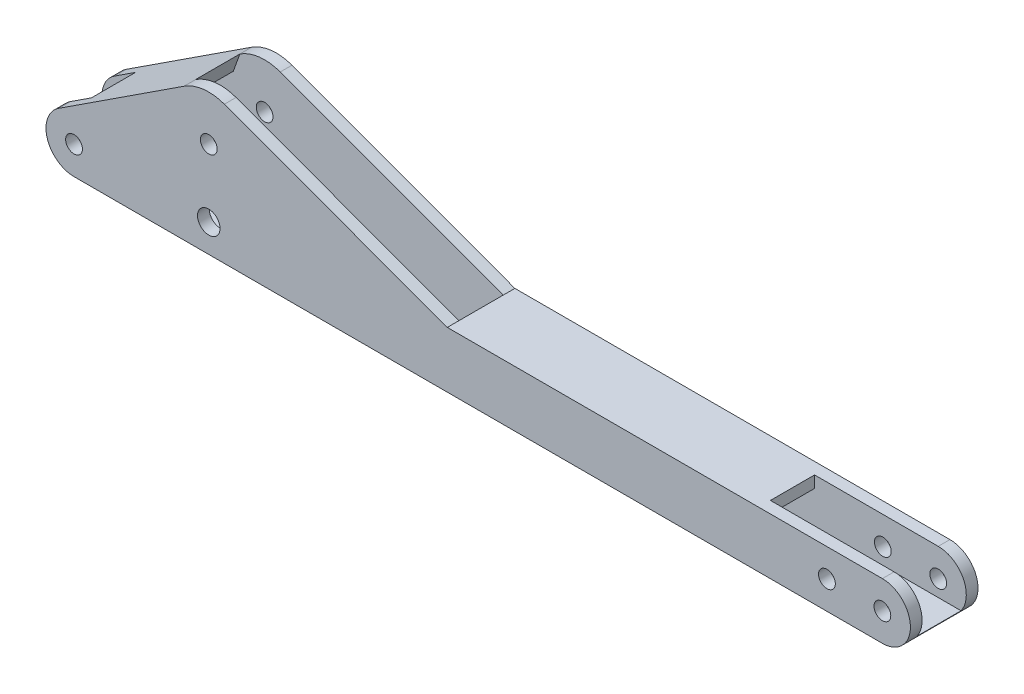
ISO-10303-21;
HEADER;
FILE_DESCRIPTION(('STEP AP214'),'2;1');
FILE_NAME('part.step','',(''),(''),'','','');
FILE_SCHEMA(('AUTOMOTIVE_DESIGN { 1 0 10303 214 1 1 1 1 }'));
ENDSEC;
DATA;
#1=APPLICATION_CONTEXT('core data for automotive mechanical design processes');
#2=APPLICATION_PROTOCOL_DEFINITION('international standard','automotive_design',2000,#1);
#3=PRODUCT_CONTEXT('',#1,'mechanical');
#4=PRODUCT('Part','Part','',(#3));
#5=PRODUCT_RELATED_PRODUCT_CATEGORY('part','',(#4));
#6=PRODUCT_DEFINITION_FORMATION('','',#4);
#7=PRODUCT_DEFINITION_CONTEXT('part definition',#1,'design');
#8=PRODUCT_DEFINITION('design','',#6,#7);
#9=PRODUCT_DEFINITION_SHAPE('','',#8);
#10=(LENGTH_UNIT() NAMED_UNIT(*) SI_UNIT(.MILLI.,.METRE.));
#11=(NAMED_UNIT(*) PLANE_ANGLE_UNIT() SI_UNIT($,.RADIAN.));
#12=(NAMED_UNIT(*) SI_UNIT($,.STERADIAN.) SOLID_ANGLE_UNIT());
#13=UNCERTAINTY_MEASURE_WITH_UNIT(LENGTH_MEASURE(1.E-05),#10,'distance_accuracy_value','');
#14=(GEOMETRIC_REPRESENTATION_CONTEXT(3) GLOBAL_UNCERTAINTY_ASSIGNED_CONTEXT((#13)) GLOBAL_UNIT_ASSIGNED_CONTEXT((#10,
#11,#12)) REPRESENTATION_CONTEXT('',''));
#15=CARTESIAN_POINT('',(0.,0.,0.));
#16=DIRECTION('',(0.,0.,1.));
#17=DIRECTION('',(1.,0.,0.));
#18=AXIS2_PLACEMENT_3D('',#15,#16,#17);
#19=CARTESIAN_POINT('',(0.,0.,153.));
#20=DIRECTION('',(0.,0.,-1.));
#21=DIRECTION('',(-1.,0.,0.));
#22=AXIS2_PLACEMENT_3D('',#19,#20,#21);
#23=CYLINDRICAL_SURFACE('',#22,127.);
#24=CARTESIAN_POINT('',(0.,0.,100.));
#25=DIRECTION('',(0.,0.,-1.));
#26=DIRECTION('',(-1.,0.,0.));
#27=AXIS2_PLACEMENT_3D('',#24,#25,#26);
#28=CIRCLE('',#27,127.);
#29=CARTESIAN_POINT('',(0.,-127.,100.));
#30=VERTEX_POINT('',#29);
#31=CARTESIAN_POINT('',(-69.4149225897887,106.351156654987,100.));
#32=VERTEX_POINT('',#31);
#33=EDGE_CURVE('E315',#30,#32,#28,.T.);
#34=ORIENTED_EDGE('',*,*,#33,.F.);
#35=DIRECTION('',(0.,0.,-1.));
#36=VECTOR('',#35,1.);
#37=CARTESIAN_POINT('',(0.,-127.,153.));
#38=LINE('',#37,#36);
#39=CARTESIAN_POINT('',(0.,-127.,153.));
#40=VERTEX_POINT('',#39);
#41=EDGE_CURVE('E495',#40,#30,#38,.T.);
#42=ORIENTED_EDGE('',*,*,#41,.F.);
#43=CARTESIAN_POINT('',(0.,0.,153.));
#44=DIRECTION('',(0.,0.,1.));
#45=DIRECTION('',(1.,0.,0.));
#46=AXIS2_PLACEMENT_3D('',#43,#44,#45);
#47=CIRCLE('',#46,127.);
#48=CARTESIAN_POINT('',(-69.4149225897887,106.351156654987,153.));
#49=VERTEX_POINT('',#48);
#50=EDGE_CURVE('E417',#49,#40,#47,.T.);
#51=ORIENTED_EDGE('',*,*,#50,.F.);
#52=DIRECTION('',(0.,0.,-1.));
#53=VECTOR('',#52,1.);
#54=CARTESIAN_POINT('',(-69.4149225897887,106.351156654987,153.));
#55=LINE('',#54,#53);
#56=EDGE_CURVE('E466',#49,#32,#55,.T.);
#57=ORIENTED_EDGE('',*,*,#56,.T.);
#58=EDGE_LOOP('',(#34,#42,#51,#57));
#59=FACE_BOUND('',#58,.T.);
#60=ADVANCED_FACE('F45',(#59),#23,.T.);
#61=CARTESIAN_POINT('',(1690.,127.,153.));
#62=DIRECTION('',(-0.344538386114745,-0.938772230359125,0.));
#63=DIRECTION('',(0.938772230359126,-0.344538386114745,0.));
#64=AXIS2_PLACEMENT_3D('',#61,#62,#63);
#65=PLANE('',#64);
#66=DIRECTION('',(0.938772230359126,-0.344538386114745,0.));
#67=VECTOR('',#66,1.);
#68=CARTESIAN_POINT('',(1690.,127.,100.));
#69=LINE('',#68,#67);
#70=CARTESIAN_POINT('',(680.630369153523,497.448307223621,100.));
#71=VERTEX_POINT('',#70);
#72=CARTESIAN_POINT('',(1690.,127.,100.));
#73=VERTEX_POINT('',#72);
#74=EDGE_CURVE('E324',#71,#73,#69,.T.);
#75=ORIENTED_EDGE('',*,*,#74,.F.);
#76=DIRECTION('',(0.,0.,-1.));
#77=VECTOR('',#76,1.);
#78=CARTESIAN_POINT('',(680.630369153523,497.448307223621,153.));
#79=LINE('',#78,#77);
#80=CARTESIAN_POINT('',(680.630369153523,497.448307223621,153.));
#81=VERTEX_POINT('',#80);
#82=EDGE_CURVE('E476',#81,#71,#79,.T.);
#83=ORIENTED_EDGE('',*,*,#82,.F.);
#84=DIRECTION('',(-0.938772230359125,0.344538386114745,0.));
#85=VECTOR('',#84,1.);
#86=CARTESIAN_POINT('',(1690.,127.,153.));
#87=LINE('',#86,#85);
#88=CARTESIAN_POINT('',(1690.,127.,153.));
#89=VERTEX_POINT('',#88);
#90=EDGE_CURVE('E431',#89,#81,#87,.T.);
#91=ORIENTED_EDGE('',*,*,#90,.F.);
#92=DIRECTION('',(0.,0.,-1.));
#93=VECTOR('',#92,1.);
#94=CARTESIAN_POINT('',(1690.,127.,153.));
#95=LINE('',#94,#93);
#96=EDGE_CURVE('E481',#89,#73,#95,.T.);
#97=ORIENTED_EDGE('',*,*,#96,.T.);
#98=EDGE_LOOP('',(#75,#83,#91,#97));
#99=FACE_BOUND('',#98,.T.);
#100=ADVANCED_FACE('F584',(#99),#65,.F.);
#101=CARTESIAN_POINT('',(610.,305.,153.));
#102=DIRECTION('',(0.,0.,-1.));
#103=DIRECTION('',(-1.,0.,0.));
#104=AXIS2_PLACEMENT_3D('',#101,#102,#103);
#105=CYLINDRICAL_SURFACE('',#104,205.);
#106=CARTESIAN_POINT('',(610.,305.,100.));
#107=DIRECTION('',(0.,0.,-1.));
#108=DIRECTION('',(-1.,0.,0.));
#109=AXIS2_PLACEMENT_3D('',#106,#107,#108);
#110=CIRCLE('',#109,205.);
#111=CARTESIAN_POINT('',(497.952290307821,476.66918987616,100.));
#112=VERTEX_POINT('',#111);
#113=EDGE_CURVE('E321',#112,#71,#110,.T.);
#114=ORIENTED_EDGE('',*,*,#113,.F.);
#115=DIRECTION('',(0.,0.,-1.));
#116=VECTOR('',#115,1.);
#117=CARTESIAN_POINT('',(497.952290307821,476.66918987616,153.));
#118=LINE('',#117,#116);
#119=CARTESIAN_POINT('',(497.952290307821,476.66918987616,153.));
#120=VERTEX_POINT('',#119);
#121=EDGE_CURVE('E471',#120,#112,#118,.T.);
#122=ORIENTED_EDGE('',*,*,#121,.F.);
#123=CARTESIAN_POINT('',(610.,305.,153.));
#124=DIRECTION('',(0.,0.,1.));
#125=DIRECTION('',(1.,0.,0.));
#126=AXIS2_PLACEMENT_3D('',#123,#124,#125);
#127=CIRCLE('',#126,205.);
#128=EDGE_CURVE('E434',#81,#120,#127,.T.);
#129=ORIENTED_EDGE('',*,*,#128,.F.);
#130=ORIENTED_EDGE('',*,*,#82,.T.);
#131=EDGE_LOOP('',(#114,#122,#129,#130));
#132=FACE_BOUND('',#131,.T.);
#133=ADVANCED_FACE('F588',(#132),#105,.T.);
#134=CARTESIAN_POINT('',(0.,0.,153.));
#135=DIRECTION('',(0.,0.,-1.));
#136=DIRECTION('',(-1.,0.,0.));
#137=AXIS2_PLACEMENT_3D('',#134,#135,#136);
#138=CYLINDRICAL_SURFACE('',#137,38.);
#139=CARTESIAN_POINT('',(0.,0.,153.));
#140=DIRECTION('',(0.,0.,1.));
#141=DIRECTION('',(1.,0.,0.));
#142=AXIS2_PLACEMENT_3D('',#139,#140,#141);
#143=CIRCLE('',#142,38.);
#144=CARTESIAN_POINT('',(38.,0.,153.));
#145=VERTEX_POINT('',#144);
#146=EDGE_CURVE('E409',#145,#145,#143,.T.);
#147=ORIENTED_EDGE('',*,*,#146,.T.);
#148=EDGE_LOOP('',(#147));
#149=FACE_BOUND('',#148,.T.);
#150=CARTESIAN_POINT('',(0.,0.,100.));
#151=DIRECTION('',(0.,0.,-1.));
#152=DIRECTION('',(-1.,0.,0.));
#153=AXIS2_PLACEMENT_3D('',#150,#151,#152);
#154=CIRCLE('',#153,38.);
#155=CARTESIAN_POINT('',(-38.,0.,100.));
#156=VERTEX_POINT('',#155);
#157=EDGE_CURVE('E308',#156,#156,#154,.T.);
#158=ORIENTED_EDGE('',*,*,#157,.T.);
#159=EDGE_LOOP('',(#158));
#160=FACE_BOUND('',#159,.T.);
#161=ADVANCED_FACE('F645',(#149,#160),#138,.F.);
#162=CARTESIAN_POINT('',(610.,0.,153.));
#163=DIRECTION('',(0.,0.,-1.));
#164=DIRECTION('',(-1.,0.,0.));
#165=AXIS2_PLACEMENT_3D('',#162,#163,#164);
#166=CYLINDRICAL_SURFACE('',#165,51.0000000000001);
#167=CARTESIAN_POINT('',(610.,0.,153.));
#168=DIRECTION('',(0.,0.,1.));
#169=DIRECTION('',(1.,0.,0.));
#170=AXIS2_PLACEMENT_3D('',#167,#168,#169);
#171=CIRCLE('',#170,51.0000000000001);
#172=CARTESIAN_POINT('',(661.,0.,153.));
#173=VERTEX_POINT('',#172);
#174=EDGE_CURVE('E401',#173,#173,#171,.T.);
#175=ORIENTED_EDGE('',*,*,#174,.T.);
#176=EDGE_LOOP('',(#175));
#177=FACE_BOUND('',#176,.T.);
#178=CARTESIAN_POINT('',(610.,0.,100.));
#179=DIRECTION('',(0.,0.,-1.));
#180=DIRECTION('',(-1.,0.,0.));
#181=AXIS2_PLACEMENT_3D('',#178,#179,#180);
#182=CIRCLE('',#181,51.0000000000001);
#183=CARTESIAN_POINT('',(559.,0.,100.));
#184=VERTEX_POINT('',#183);
#185=EDGE_CURVE('E304',#184,#184,#182,.T.);
#186=ORIENTED_EDGE('',*,*,#185,.T.);
#187=EDGE_LOOP('',(#186));
#188=FACE_BOUND('',#187,.T.);
#189=ADVANCED_FACE('F654',(#177,#188),#166,.F.);
#190=CARTESIAN_POINT('',(610.,305.,153.));
#191=DIRECTION('',(0.,0.,-1.));
#192=DIRECTION('',(-1.,0.,0.));
#193=AXIS2_PLACEMENT_3D('',#190,#191,#192);
#194=CYLINDRICAL_SURFACE('',#193,38.);
#195=CARTESIAN_POINT('',(610.,305.,153.));
#196=DIRECTION('',(0.,0.,1.));
#197=DIRECTION('',(1.,0.,0.));
#198=AXIS2_PLACEMENT_3D('',#195,#196,#197);
#199=CIRCLE('',#198,38.);
#200=CARTESIAN_POINT('',(648.,305.,153.));
#201=VERTEX_POINT('',#200);
#202=EDGE_CURVE('E393',#201,#201,#199,.T.);
#203=ORIENTED_EDGE('',*,*,#202,.T.);
#204=EDGE_LOOP('',(#203));
#205=FACE_BOUND('',#204,.T.);
#206=CARTESIAN_POINT('',(610.,305.,100.));
#207=DIRECTION('',(0.,0.,-1.));
#208=DIRECTION('',(-1.,0.,0.));
#209=AXIS2_PLACEMENT_3D('',#206,#207,#208);
#210=CIRCLE('',#209,38.);
#211=CARTESIAN_POINT('',(572.,305.,100.));
#212=VERTEX_POINT('',#211);
#213=EDGE_CURVE('E300',#212,#212,#210,.T.);
#214=ORIENTED_EDGE('',*,*,#213,.T.);
#215=EDGE_LOOP('',(#214));
#216=FACE_BOUND('',#215,.T.);
#217=ADVANCED_FACE('F662',(#205,#216),#194,.F.);
#218=CARTESIAN_POINT('',(3409.,0.,153.));
#219=DIRECTION('',(0.,0.,-1.));
#220=DIRECTION('',(-1.,0.,0.));
#221=AXIS2_PLACEMENT_3D('',#218,#219,#220);
#222=CYLINDRICAL_SURFACE('',#221,38.0000000000003);
#223=CARTESIAN_POINT('',(3409.,0.,153.));
#224=DIRECTION('',(0.,0.,1.));
#225=DIRECTION('',(1.,0.,0.));
#226=AXIS2_PLACEMENT_3D('',#223,#224,#225);
#227=CIRCLE('',#226,38.0000000000003);
#228=CARTESIAN_POINT('',(3447.,0.,153.));
#229=VERTEX_POINT('',#228);
#230=EDGE_CURVE('E385',#229,#229,#227,.T.);
#231=ORIENTED_EDGE('',*,*,#230,.T.);
#232=EDGE_LOOP('',(#231));
#233=FACE_BOUND('',#232,.T.);
#234=CARTESIAN_POINT('',(3409.,0.,100.));
#235=DIRECTION('',(0.,0.,-1.));
#236=DIRECTION('',(-1.,0.,0.));
#237=AXIS2_PLACEMENT_3D('',#234,#235,#236);
#238=CIRCLE('',#237,38.0000000000003);
#239=CARTESIAN_POINT('',(3371.,0.,100.));
#240=VERTEX_POINT('',#239);
#241=EDGE_CURVE('E296',#240,#240,#238,.T.);
#242=ORIENTED_EDGE('',*,*,#241,.T.);
#243=EDGE_LOOP('',(#242));
#244=FACE_BOUND('',#243,.T.);
#245=ADVANCED_FACE('F669',(#233,#244),#222,.F.);
#246=CARTESIAN_POINT('',(3660.,0.,153.));
#247=DIRECTION('',(0.,0.,-1.));
#248=DIRECTION('',(-1.,0.,0.));
#249=AXIS2_PLACEMENT_3D('',#246,#247,#248);
#250=CYLINDRICAL_SURFACE('',#249,37.9999999999998);
#251=CARTESIAN_POINT('',(3660.,0.,153.));
#252=DIRECTION('',(0.,0.,1.));
#253=DIRECTION('',(1.,0.,0.));
#254=AXIS2_PLACEMENT_3D('',#251,#252,#253);
#255=CIRCLE('',#254,37.9999999999998);
#256=CARTESIAN_POINT('',(3698.,0.,153.));
#257=VERTEX_POINT('',#256);
#258=EDGE_CURVE('E377',#257,#257,#255,.T.);
#259=ORIENTED_EDGE('',*,*,#258,.T.);
#260=EDGE_LOOP('',(#259));
#261=FACE_BOUND('',#260,.T.);
#262=CARTESIAN_POINT('',(3660.,0.,100.));
#263=DIRECTION('',(0.,0.,-1.));
#264=DIRECTION('',(-1.,0.,0.));
#265=AXIS2_PLACEMENT_3D('',#262,#263,#264);
#266=CIRCLE('',#265,37.9999999999998);
#267=CARTESIAN_POINT('',(3622.,0.,100.));
#268=VERTEX_POINT('',#267);
#269=EDGE_CURVE('E273',#268,#268,#266,.T.);
#270=ORIENTED_EDGE('',*,*,#269,.T.);
#271=EDGE_LOOP('',(#270));
#272=FACE_BOUND('',#271,.T.);
#273=ADVANCED_FACE('F581',(#261,#272),#250,.F.);
#274=CARTESIAN_POINT('',(0.,0.,153.));
#275=DIRECTION('',(0.,0.,1.));
#276=DIRECTION('',(1.,0.,0.));
#277=AXIS2_PLACEMENT_3D('',#274,#275,#276);
#278=PLANE('',#277);
#279=ORIENTED_EDGE('',*,*,#230,.F.);
#280=EDGE_LOOP('',(#279));
#281=FACE_BOUND('',#280,.T.);
#282=ORIENTED_EDGE('',*,*,#174,.F.);
#283=EDGE_LOOP('',(#282));
#284=FACE_BOUND('',#283,.T.);
#285=ORIENTED_EDGE('',*,*,#50,.T.);
#286=DIRECTION('',(1.,0.,0.));
#287=VECTOR('',#286,1.);
#288=CARTESIAN_POINT('',(0.,-127.,153.));
#289=LINE('',#288,#287);
#290=CARTESIAN_POINT('',(3660.,-127.,153.));
#291=VERTEX_POINT('',#290);
#292=EDGE_CURVE('E421',#40,#291,#289,.T.);
#293=ORIENTED_EDGE('',*,*,#292,.T.);
#294=CARTESIAN_POINT('',(3660.,0.,153.));
#295=DIRECTION('',(0.,0.,1.));
#296=DIRECTION('',(1.,0.,0.));
#297=AXIS2_PLACEMENT_3D('',#294,#295,#296);
#298=CIRCLE('',#297,127.);
#299=CARTESIAN_POINT('',(3660.,127.,153.));
#300=VERTEX_POINT('',#299);
#301=EDGE_CURVE('E425',#291,#300,#298,.T.);
#302=ORIENTED_EDGE('',*,*,#301,.T.);
#303=DIRECTION('',(-1.,0.,0.));
#304=VECTOR('',#303,1.);
#305=CARTESIAN_POINT('',(3660.,127.,153.));
#306=LINE('',#305,#304);
#307=EDGE_CURVE('E428',#300,#89,#306,.T.);
#308=ORIENTED_EDGE('',*,*,#307,.T.);
#309=ORIENTED_EDGE('',*,*,#90,.T.);
#310=ORIENTED_EDGE('',*,*,#128,.T.);
#311=DIRECTION('',(-0.837410682322734,-0.546574193620383,0.));
#312=VECTOR('',#311,1.);
#313=CARTESIAN_POINT('',(-69.4149225897887,106.351156654987,153.));
#314=LINE('',#313,#312);
#315=EDGE_CURVE('E437',#120,#49,#314,.T.);
#316=ORIENTED_EDGE('',*,*,#315,.T.);
#317=EDGE_LOOP('',(#285,#293,#302,#308,#309,#310,#316));
#318=FACE_BOUND('',#317,.T.);
#319=ORIENTED_EDGE('',*,*,#146,.F.);
#320=EDGE_LOOP('',(#319));
#321=FACE_BOUND('',#320,.T.);
#322=ORIENTED_EDGE('',*,*,#202,.F.);
#323=EDGE_LOOP('',(#322));
#324=FACE_BOUND('',#323,.T.);
#325=ORIENTED_EDGE('',*,*,#258,.F.);
#326=EDGE_LOOP('',(#325));
#327=FACE_BOUND('',#326,.T.);
#328=ADVANCED_FACE('F548',(#281,#284,#318,#321,#324,#327),#278,.T.);
#329=CARTESIAN_POINT('',(0.,0.,-153.));
#330=DIRECTION('',(0.,0.,1.));
#331=DIRECTION('',(1.,0.,0.));
#332=AXIS2_PLACEMENT_3D('',#329,#330,#331);
#333=PLANE('',#332);
#334=CARTESIAN_POINT('',(0.,0.,-153.));
#335=DIRECTION('',(0.,0.,1.));
#336=DIRECTION('',(1.,0.,0.));
#337=AXIS2_PLACEMENT_3D('',#334,#335,#336);
#338=CIRCLE('',#337,127.);
#339=CARTESIAN_POINT('',(-69.4149225897887,106.351156654987,-153.));
#340=VERTEX_POINT('',#339);
#341=CARTESIAN_POINT('',(0.,-127.,-153.));
#342=VERTEX_POINT('',#341);
#343=EDGE_CURVE('E413',#340,#342,#338,.T.);
#344=ORIENTED_EDGE('',*,*,#343,.F.);
#345=DIRECTION('',(-0.837410682322734,-0.546574193620383,0.));
#346=VECTOR('',#345,1.);
#347=CARTESIAN_POINT('',(-69.4149225897887,106.351156654987,-153.));
#348=LINE('',#347,#346);
#349=CARTESIAN_POINT('',(497.952290307821,476.66918987616,-153.));
#350=VERTEX_POINT('',#349);
#351=EDGE_CURVE('E422',#350,#340,#348,.T.);
#352=ORIENTED_EDGE('',*,*,#351,.F.);
#353=CARTESIAN_POINT('',(610.,305.,-153.));
#354=DIRECTION('',(0.,0.,1.));
#355=DIRECTION('',(1.,0.,0.));
#356=AXIS2_PLACEMENT_3D('',#353,#354,#355);
#357=CIRCLE('',#356,205.);
#358=CARTESIAN_POINT('',(680.630369153523,497.448307223621,-153.));
#359=VERTEX_POINT('',#358);
#360=EDGE_CURVE('E459',#359,#350,#357,.T.);
#361=ORIENTED_EDGE('',*,*,#360,.F.);
#362=DIRECTION('',(-0.938772230359125,0.344538386114745,0.));
#363=VECTOR('',#362,1.);
#364=CARTESIAN_POINT('',(1690.,127.,-153.));
#365=LINE('',#364,#363);
#366=CARTESIAN_POINT('',(1690.,127.,-153.));
#367=VERTEX_POINT('',#366);
#368=EDGE_CURVE('E455',#367,#359,#365,.T.);
#369=ORIENTED_EDGE('',*,*,#368,.F.);
#370=DIRECTION('',(-1.,0.,0.));
#371=VECTOR('',#370,1.);
#372=CARTESIAN_POINT('',(3660.,127.,-153.));
#373=LINE('',#372,#371);
#374=CARTESIAN_POINT('',(3660.,127.,-153.));
#375=VERTEX_POINT('',#374);
#376=EDGE_CURVE('E451',#375,#367,#373,.T.);
#377=ORIENTED_EDGE('',*,*,#376,.F.);
#378=CARTESIAN_POINT('',(3660.,0.,-153.));
#379=DIRECTION('',(0.,0.,1.));
#380=DIRECTION('',(1.,0.,0.));
#381=AXIS2_PLACEMENT_3D('',#378,#379,#380);
#382=CIRCLE('',#381,127.);
#383=CARTESIAN_POINT('',(3660.,-127.,-153.));
#384=VERTEX_POINT('',#383);
#385=EDGE_CURVE('E447',#384,#375,#382,.T.);
#386=ORIENTED_EDGE('',*,*,#385,.F.);
#387=DIRECTION('',(1.,0.,0.));
#388=VECTOR('',#387,1.);
#389=CARTESIAN_POINT('',(0.,-127.,-153.));
#390=LINE('',#389,#388);
#391=EDGE_CURVE('E444',#342,#384,#390,.T.);
#392=ORIENTED_EDGE('',*,*,#391,.F.);
#393=EDGE_LOOP('',(#344,#352,#361,#369,#377,#386,#392));
#394=FACE_BOUND('',#393,.T.);
#395=CARTESIAN_POINT('',(0.,0.,-153.));
#396=DIRECTION('',(0.,0.,1.));
#397=DIRECTION('',(1.,0.,0.));
#398=AXIS2_PLACEMENT_3D('',#395,#396,#397);
#399=CIRCLE('',#398,38.);
#400=CARTESIAN_POINT('',(38.,0.,-153.));
#401=VERTEX_POINT('',#400);
#402=EDGE_CURVE('E405',#401,#401,#399,.T.);
#403=ORIENTED_EDGE('',*,*,#402,.T.);
#404=EDGE_LOOP('',(#403));
#405=FACE_BOUND('',#404,.T.);
#406=CARTESIAN_POINT('',(610.,0.,-153.));
#407=DIRECTION('',(0.,0.,1.));
#408=DIRECTION('',(1.,0.,0.));
#409=AXIS2_PLACEMENT_3D('',#406,#407,#408);
#410=CIRCLE('',#409,51.0000000000001);
#411=CARTESIAN_POINT('',(661.,0.,-153.));
#412=VERTEX_POINT('',#411);
#413=EDGE_CURVE('E397',#412,#412,#410,.T.);
#414=ORIENTED_EDGE('',*,*,#413,.T.);
#415=EDGE_LOOP('',(#414));
#416=FACE_BOUND('',#415,.T.);
#417=CARTESIAN_POINT('',(610.,305.,-153.));
#418=DIRECTION('',(0.,0.,1.));
#419=DIRECTION('',(1.,0.,0.));
#420=AXIS2_PLACEMENT_3D('',#417,#418,#419);
#421=CIRCLE('',#420,38.);
#422=CARTESIAN_POINT('',(648.,305.,-153.));
#423=VERTEX_POINT('',#422);
#424=EDGE_CURVE('E389',#423,#423,#421,.T.);
#425=ORIENTED_EDGE('',*,*,#424,.T.);
#426=EDGE_LOOP('',(#425));
#427=FACE_BOUND('',#426,.T.);
#428=CARTESIAN_POINT('',(3409.,0.,-153.));
#429=DIRECTION('',(0.,0.,1.));
#430=DIRECTION('',(1.,0.,0.));
#431=AXIS2_PLACEMENT_3D('',#428,#429,#430);
#432=CIRCLE('',#431,38.0000000000003);
#433=CARTESIAN_POINT('',(3447.,0.,-153.));
#434=VERTEX_POINT('',#433);
#435=EDGE_CURVE('E381',#434,#434,#432,.T.);
#436=ORIENTED_EDGE('',*,*,#435,.T.);
#437=EDGE_LOOP('',(#436));
#438=FACE_BOUND('',#437,.T.);
#439=CARTESIAN_POINT('',(3660.,0.,-153.));
#440=DIRECTION('',(0.,0.,1.));
#441=DIRECTION('',(1.,0.,0.));
#442=AXIS2_PLACEMENT_3D('',#439,#440,#441);
#443=CIRCLE('',#442,37.9999999999998);
#444=CARTESIAN_POINT('',(3698.,0.,-153.));
#445=VERTEX_POINT('',#444);
#446=EDGE_CURVE('E376',#445,#445,#443,.T.);
#447=ORIENTED_EDGE('',*,*,#446,.T.);
#448=EDGE_LOOP('',(#447));
#449=FACE_BOUND('',#448,.T.);
#450=ADVANCED_FACE('F538',(#394,#405,#416,#427,#438,#449),#333,.F.);
#451=CARTESIAN_POINT('',(0.,-127.,-100.));
#452=VERTEX_POINT('',#451);
#453=EDGE_CURVE('E494',#452,#342,#38,.T.);
#454=ORIENTED_EDGE('',*,*,#453,.F.);
#455=CARTESIAN_POINT('',(0.,0.,-100.));
#456=DIRECTION('',(0.,0.,-1.));
#457=DIRECTION('',(-1.,0.,0.));
#458=AXIS2_PLACEMENT_3D('',#455,#456,#457);
#459=CIRCLE('',#458,127.);
#460=CARTESIAN_POINT('',(-69.4149225897887,106.351156654987,-100.));
#461=VERTEX_POINT('',#460);
#462=EDGE_CURVE('E354',#452,#461,#459,.T.);
#463=ORIENTED_EDGE('',*,*,#462,.T.);
#464=EDGE_CURVE('E440',#461,#340,#55,.T.);
#465=ORIENTED_EDGE('',*,*,#464,.T.);
#466=ORIENTED_EDGE('',*,*,#343,.T.);
#467=EDGE_LOOP('',(#454,#463,#465,#466));
#468=FACE_BOUND('',#467,.T.);
#469=ADVANCED_FACE('F47',(#468),#23,.T.);
#470=CARTESIAN_POINT('',(0.,-127.,153.));
#471=DIRECTION('',(0.,1.,0.));
#472=DIRECTION('',(-1.,0.,0.));
#473=AXIS2_PLACEMENT_3D('',#470,#471,#472);
#474=PLANE('',#473);
#475=DIRECTION('',(0.,0.,1.));
#476=VECTOR('',#475,1.);
#477=CARTESIAN_POINT('',(218.242094516465,-127.,-100.));
#478=LINE('',#477,#476);
#479=CARTESIAN_POINT('',(218.242094516465,-127.,-100.));
#480=VERTEX_POINT('',#479);
#481=CARTESIAN_POINT('',(218.242094516465,-127.,100.));
#482=VERTEX_POINT('',#481);
#483=EDGE_CURVE('E285',#480,#482,#478,.T.);
#484=ORIENTED_EDGE('',*,*,#483,.F.);
#485=DIRECTION('',(-1.,0.,0.));
#486=VECTOR('',#485,1.);
#487=CARTESIAN_POINT('',(0.,-127.,-100.));
#488=LINE('',#487,#486);
#489=EDGE_CURVE('E358',#480,#452,#488,.T.);
#490=ORIENTED_EDGE('',*,*,#489,.T.);
#491=ORIENTED_EDGE('',*,*,#453,.T.);
#492=ORIENTED_EDGE('',*,*,#391,.T.);
#493=DIRECTION('',(0.,0.,-1.));
#494=VECTOR('',#493,1.);
#495=CARTESIAN_POINT('',(3660.,-127.,153.));
#496=LINE('',#495,#494);
#497=EDGE_CURVE('E490',#291,#384,#496,.T.);
#498=ORIENTED_EDGE('',*,*,#497,.F.);
#499=ORIENTED_EDGE('',*,*,#292,.F.);
#500=ORIENTED_EDGE('',*,*,#41,.T.);
#501=DIRECTION('',(-1.,0.,0.));
#502=VECTOR('',#501,1.);
#503=CARTESIAN_POINT('',(0.,-127.,100.));
#504=LINE('',#503,#502);
#505=EDGE_CURVE('E318',#482,#30,#504,.T.);
#506=ORIENTED_EDGE('',*,*,#505,.F.);
#507=EDGE_LOOP('',(#484,#490,#491,#492,#498,#499,#500,#506));
#508=FACE_BOUND('',#507,.T.);
#509=ADVANCED_FACE('F543',(#508),#474,.F.);
#510=CARTESIAN_POINT('',(3660.,0.,153.));
#511=DIRECTION('',(0.,0.,-1.));
#512=DIRECTION('',(-1.,0.,0.));
#513=AXIS2_PLACEMENT_3D('',#510,#511,#512);
#514=CYLINDRICAL_SURFACE('',#513,127.);
#515=DIRECTION('',(0.,0.,-1.));
#516=VECTOR('',#515,1.);
#517=CARTESIAN_POINT('',(3660.,127.,153.));
#518=LINE('',#517,#516);
#519=CARTESIAN_POINT('',(3660.,127.,-100.));
#520=VERTEX_POINT('',#519);
#521=EDGE_CURVE('E485',#520,#375,#518,.T.);
#522=ORIENTED_EDGE('',*,*,#521,.F.);
#523=CARTESIAN_POINT('',(3660.,0.,-100.));
#524=DIRECTION('',(0.,0.,-1.));
#525=DIRECTION('',(-1.,0.,0.));
#526=AXIS2_PLACEMENT_3D('',#523,#524,#525);
#527=CIRCLE('',#526,127.);
#528=CARTESIAN_POINT('',(3763.21337122679,-74.,-100.));
#529=VERTEX_POINT('',#528);
#530=EDGE_CURVE('E372',#520,#529,#527,.T.);
#531=ORIENTED_EDGE('',*,*,#530,.T.);
#532=DIRECTION('',(0.,0.,-1.));
#533=VECTOR('',#532,1.);
#534=CARTESIAN_POINT('',(3763.21337122679,-74.,153.));
#535=LINE('',#534,#533);
#536=CARTESIAN_POINT('',(3763.21337122679,-74.,100.));
#537=VERTEX_POINT('',#536);
#538=EDGE_CURVE('E11',#529,#537,#535,.F.);
#539=ORIENTED_EDGE('',*,*,#538,.T.);
#540=CARTESIAN_POINT('',(3660.,0.,100.));
#541=DIRECTION('',(0.,0.,-1.));
#542=DIRECTION('',(-1.,0.,0.));
#543=AXIS2_PLACEMENT_3D('',#540,#541,#542);
#544=CIRCLE('',#543,127.);
#545=CARTESIAN_POINT('',(3660.,127.,100.));
#546=VERTEX_POINT('',#545);
#547=EDGE_CURVE('E330',#546,#537,#544,.T.);
#548=ORIENTED_EDGE('',*,*,#547,.F.);
#549=EDGE_CURVE('E486',#300,#546,#518,.T.);
#550=ORIENTED_EDGE('',*,*,#549,.F.);
#551=ORIENTED_EDGE('',*,*,#301,.F.);
#552=ORIENTED_EDGE('',*,*,#497,.T.);
#553=ORIENTED_EDGE('',*,*,#385,.T.);
#554=EDGE_LOOP('',(#522,#531,#539,#548,#550,#551,#552,#553));
#555=FACE_BOUND('',#554,.T.);
#556=ADVANCED_FACE('F518',(#555),#514,.T.);
#557=CARTESIAN_POINT('',(3660.,127.,153.));
#558=DIRECTION('',(0.,-1.,0.));
#559=DIRECTION('',(1.,0.,0.));
#560=AXIS2_PLACEMENT_3D('',#557,#558,#559);
#561=PLANE('',#560);
#562=DIRECTION('',(0.,0.,-1.));
#563=VECTOR('',#562,1.);
#564=CARTESIAN_POINT('',(3100.,127.,153.));
#565=LINE('',#564,#563);
#566=CARTESIAN_POINT('',(3100.,127.,100.));
#567=VERTEX_POINT('',#566);
#568=CARTESIAN_POINT('',(3100.,127.,-100.));
#569=VERTEX_POINT('',#568);
#570=EDGE_CURVE('E54',#567,#569,#565,.T.);
#571=ORIENTED_EDGE('',*,*,#570,.T.);
#572=DIRECTION('',(1.,0.,0.));
#573=VECTOR('',#572,1.);
#574=CARTESIAN_POINT('',(3660.,127.,-100.));
#575=LINE('',#574,#573);
#576=EDGE_CURVE('E368',#569,#520,#575,.T.);
#577=ORIENTED_EDGE('',*,*,#576,.T.);
#578=ORIENTED_EDGE('',*,*,#521,.T.);
#579=ORIENTED_EDGE('',*,*,#376,.T.);
#580=CARTESIAN_POINT('',(1690.,127.,-100.));
#581=VERTEX_POINT('',#580);
#582=EDGE_CURVE('E480',#581,#367,#95,.T.);
#583=ORIENTED_EDGE('',*,*,#582,.F.);
#584=DIRECTION('',(0.,0.,1.));
#585=VECTOR('',#584,1.);
#586=CARTESIAN_POINT('',(1690.,127.,-100.));
#587=LINE('',#586,#585);
#588=EDGE_CURVE('E269',#581,#73,#587,.T.);
#589=ORIENTED_EDGE('',*,*,#588,.T.);
#590=ORIENTED_EDGE('',*,*,#96,.F.);
#591=ORIENTED_EDGE('',*,*,#307,.F.);
#592=ORIENTED_EDGE('',*,*,#549,.T.);
#593=DIRECTION('',(1.,0.,0.));
#594=VECTOR('',#593,1.);
#595=CARTESIAN_POINT('',(3660.,127.,100.));
#596=LINE('',#595,#594);
#597=EDGE_CURVE('E327',#567,#546,#596,.T.);
#598=ORIENTED_EDGE('',*,*,#597,.F.);
#599=EDGE_LOOP('',(#571,#577,#578,#579,#583,#589,#590,#591,#592,#598));
#600=FACE_BOUND('',#599,.T.);
#601=ADVANCED_FACE('F508',(#600),#561,.F.);
#602=CARTESIAN_POINT('',(680.630369153523,497.448307223621,-100.));
#603=VERTEX_POINT('',#602);
#604=EDGE_CURVE('E475',#603,#359,#79,.T.);
#605=ORIENTED_EDGE('',*,*,#604,.F.);
#606=DIRECTION('',(0.938772230359126,-0.344538386114745,0.));
#607=VECTOR('',#606,1.);
#608=CARTESIAN_POINT('',(1690.,127.,-100.));
#609=LINE('',#608,#607);
#610=EDGE_CURVE('E364',#603,#581,#609,.T.);
#611=ORIENTED_EDGE('',*,*,#610,.T.);
#612=ORIENTED_EDGE('',*,*,#582,.T.);
#613=ORIENTED_EDGE('',*,*,#368,.T.);
#614=EDGE_LOOP('',(#605,#611,#612,#613));
#615=FACE_BOUND('',#614,.T.);
#616=ADVANCED_FACE('F591',(#615),#65,.F.);
#617=CARTESIAN_POINT('',(497.952290307821,476.66918987616,-100.));
#618=VERTEX_POINT('',#617);
#619=EDGE_CURVE('E470',#618,#350,#118,.T.);
#620=ORIENTED_EDGE('',*,*,#619,.F.);
#621=CARTESIAN_POINT('',(610.,305.,-100.));
#622=DIRECTION('',(0.,0.,-1.));
#623=DIRECTION('',(-1.,0.,0.));
#624=AXIS2_PLACEMENT_3D('',#621,#622,#623);
#625=CIRCLE('',#624,205.);
#626=EDGE_CURVE('E216',#618,#603,#625,.T.);
#627=ORIENTED_EDGE('',*,*,#626,.T.);
#628=ORIENTED_EDGE('',*,*,#604,.T.);
#629=ORIENTED_EDGE('',*,*,#360,.T.);
#630=EDGE_LOOP('',(#620,#627,#628,#629));
#631=FACE_BOUND('',#630,.T.);
#632=ADVANCED_FACE('F608',(#631),#105,.T.);
#633=CARTESIAN_POINT('',(-69.4149225897887,106.351156654987,153.));
#634=DIRECTION('',(0.546574193620383,-0.837410682322734,0.));
#635=DIRECTION('',(0.837410682322734,0.546574193620383,0.));
#636=AXIS2_PLACEMENT_3D('',#633,#634,#635);
#637=PLANE('',#636);
#638=ORIENTED_EDGE('',*,*,#464,.F.);
#639=DIRECTION('',(0.837410682322734,0.546574193620383,0.));
#640=VECTOR('',#639,1.);
#641=CARTESIAN_POINT('',(-69.4149225897887,106.351156654987,-100.));
#642=LINE('',#641,#640);
#643=CARTESIAN_POINT('',(25.5,168.301700602146,-100.));
#644=VERTEX_POINT('',#643);
#645=EDGE_CURVE('E350',#461,#644,#642,.T.);
#646=ORIENTED_EDGE('',*,*,#645,.T.);
#647=DIRECTION('',(0.,0.,1.));
#648=VECTOR('',#647,1.);
#649=CARTESIAN_POINT('',(25.5,168.301700602146,-100.));
#650=LINE('',#649,#648);
#651=CARTESIAN_POINT('',(25.5,168.301700602146,100.));
#652=VERTEX_POINT('',#651);
#653=EDGE_CURVE('E288',#644,#652,#650,.T.);
#654=ORIENTED_EDGE('',*,*,#653,.T.);
#655=DIRECTION('',(0.837410682322734,0.546574193620383,0.));
#656=VECTOR('',#655,1.);
#657=CARTESIAN_POINT('',(-69.4149225897887,106.351156654987,100.));
#658=LINE('',#657,#656);
#659=EDGE_CURVE('E312',#32,#652,#658,.T.);
#660=ORIENTED_EDGE('',*,*,#659,.F.);
#661=ORIENTED_EDGE('',*,*,#56,.F.);
#662=ORIENTED_EDGE('',*,*,#315,.F.);
#663=ORIENTED_EDGE('',*,*,#121,.T.);
#664=DIRECTION('',(0.,0.,1.));
#665=VECTOR('',#664,1.);
#666=CARTESIAN_POINT('',(497.952290307821,476.66918987616,-100.));
#667=LINE('',#666,#665);
#668=EDGE_CURVE('E203',#618,#112,#667,.T.);
#669=ORIENTED_EDGE('',*,*,#668,.F.);
#670=ORIENTED_EDGE('',*,*,#619,.T.);
#671=ORIENTED_EDGE('',*,*,#351,.T.);
#672=EDGE_LOOP('',(#638,#646,#654,#660,#661,#662,#663,#669,#670,#671));
#673=FACE_BOUND('',#672,.T.);
#674=ADVANCED_FACE('F533',(#673),#637,.F.);
#675=CARTESIAN_POINT('',(0.,0.,-100.));
#676=DIRECTION('',(0.,0.,-1.));
#677=DIRECTION('',(-1.,0.,0.));
#678=AXIS2_PLACEMENT_3D('',#675,#676,#677);
#679=CIRCLE('',#678,38.);
#680=CARTESIAN_POINT('',(-38.,0.,-100.));
#681=VERTEX_POINT('',#680);
#682=EDGE_CURVE('E346',#681,#681,#679,.T.);
#683=ORIENTED_EDGE('',*,*,#682,.F.);
#684=EDGE_LOOP('',(#683));
#685=FACE_BOUND('',#684,.T.);
#686=ORIENTED_EDGE('',*,*,#402,.F.);
#687=EDGE_LOOP('',(#686));
#688=FACE_BOUND('',#687,.T.);
#689=ADVANCED_FACE('F607',(#685,#688),#138,.F.);
#690=CARTESIAN_POINT('',(610.,0.,-100.));
#691=DIRECTION('',(0.,0.,-1.));
#692=DIRECTION('',(-1.,0.,0.));
#693=AXIS2_PLACEMENT_3D('',#690,#691,#692);
#694=CIRCLE('',#693,51.0000000000001);
#695=CARTESIAN_POINT('',(559.,0.,-100.));
#696=VERTEX_POINT('',#695);
#697=EDGE_CURVE('E342',#696,#696,#694,.T.);
#698=ORIENTED_EDGE('',*,*,#697,.F.);
#699=EDGE_LOOP('',(#698));
#700=FACE_BOUND('',#699,.T.);
#701=ORIENTED_EDGE('',*,*,#413,.F.);
#702=EDGE_LOOP('',(#701));
#703=FACE_BOUND('',#702,.T.);
#704=ADVANCED_FACE('F643',(#700,#703),#166,.F.);
#705=CARTESIAN_POINT('',(610.,305.,-100.));
#706=DIRECTION('',(0.,0.,-1.));
#707=DIRECTION('',(-1.,0.,0.));
#708=AXIS2_PLACEMENT_3D('',#705,#706,#707);
#709=CIRCLE('',#708,38.);
#710=CARTESIAN_POINT('',(572.,305.,-100.));
#711=VERTEX_POINT('',#710);
#712=EDGE_CURVE('E338',#711,#711,#709,.T.);
#713=ORIENTED_EDGE('',*,*,#712,.F.);
#714=EDGE_LOOP('',(#713));
#715=FACE_BOUND('',#714,.T.);
#716=ORIENTED_EDGE('',*,*,#424,.F.);
#717=EDGE_LOOP('',(#716));
#718=FACE_BOUND('',#717,.T.);
#719=ADVANCED_FACE('F651',(#715,#718),#194,.F.);
#720=CARTESIAN_POINT('',(3409.,0.,-100.));
#721=DIRECTION('',(0.,0.,-1.));
#722=DIRECTION('',(-1.,0.,0.));
#723=AXIS2_PLACEMENT_3D('',#720,#721,#722);
#724=CIRCLE('',#723,38.0000000000003);
#725=CARTESIAN_POINT('',(3371.,0.,-100.));
#726=VERTEX_POINT('',#725);
#727=EDGE_CURVE('E334',#726,#726,#724,.T.);
#728=ORIENTED_EDGE('',*,*,#727,.F.);
#729=EDGE_LOOP('',(#728));
#730=FACE_BOUND('',#729,.T.);
#731=ORIENTED_EDGE('',*,*,#435,.F.);
#732=EDGE_LOOP('',(#731));
#733=FACE_BOUND('',#732,.T.);
#734=ADVANCED_FACE('F578',(#730,#733),#222,.F.);
#735=CARTESIAN_POINT('',(3660.,0.,-100.));
#736=DIRECTION('',(0.,0.,-1.));
#737=DIRECTION('',(-1.,0.,0.));
#738=AXIS2_PLACEMENT_3D('',#735,#736,#737);
#739=CIRCLE('',#738,37.9999999999998);
#740=CARTESIAN_POINT('',(3622.,0.,-100.));
#741=VERTEX_POINT('',#740);
#742=EDGE_CURVE('E333',#741,#741,#739,.T.);
#743=ORIENTED_EDGE('',*,*,#742,.F.);
#744=EDGE_LOOP('',(#743));
#745=FACE_BOUND('',#744,.T.);
#746=ORIENTED_EDGE('',*,*,#446,.F.);
#747=EDGE_LOOP('',(#746));
#748=FACE_BOUND('',#747,.T.);
#749=ADVANCED_FACE('F571',(#745,#748),#250,.F.);
#750=CARTESIAN_POINT('',(4168.77329014196,-74.,-100.));
#751=DIRECTION('',(0.,-1.,0.));
#752=DIRECTION('',(0.,0.,-1.));
#753=AXIS2_PLACEMENT_3D('',#750,#751,#752);
#754=PLANE('',#753);
#755=DIRECTION('',(1.,0.,0.));
#756=VECTOR('',#755,1.);
#757=CARTESIAN_POINT('',(299.443817322153,-74.,-100.));
#758=LINE('',#757,#756);
#759=CARTESIAN_POINT('',(299.443817322153,-74.,-100.));
#760=VERTEX_POINT('',#759);
#761=EDGE_CURVE('E232',#760,#529,#758,.T.);
#762=ORIENTED_EDGE('',*,*,#761,.F.);
#763=DIRECTION('',(0.,0.,1.));
#764=VECTOR('',#763,1.);
#765=CARTESIAN_POINT('',(299.443817322153,-74.,-100.));
#766=LINE('',#765,#764);
#767=CARTESIAN_POINT('',(299.443817322153,-74.,100.));
#768=VERTEX_POINT('',#767);
#769=EDGE_CURVE('E281',#760,#768,#766,.T.);
#770=ORIENTED_EDGE('',*,*,#769,.T.);
#771=DIRECTION('',(1.,0.,0.));
#772=VECTOR('',#771,1.);
#773=CARTESIAN_POINT('',(4168.77329014196,-74.,100.));
#774=LINE('',#773,#772);
#775=EDGE_CURVE('E260',#768,#537,#774,.T.);
#776=ORIENTED_EDGE('',*,*,#775,.T.);
#777=ORIENTED_EDGE('',*,*,#538,.F.);
#778=EDGE_LOOP('',(#762,#770,#776,#777));
#779=FACE_BOUND('',#778,.T.);
#780=ADVANCED_FACE('F569',(#779),#754,.F.);
#781=CARTESIAN_POINT('',(3100.,127.,-100.));
#782=DIRECTION('',(-1.,0.,0.));
#783=DIRECTION('',(0.,-1.,0.));
#784=AXIS2_PLACEMENT_3D('',#781,#782,#783);
#785=PLANE('',#784);
#786=DIRECTION('',(0.,-1.,0.));
#787=VECTOR('',#786,1.);
#788=CARTESIAN_POINT('',(3100.,127.,100.));
#789=LINE('',#788,#787);
#790=CARTESIAN_POINT('',(3100.,74.0000000000004,100.));
#791=VERTEX_POINT('',#790);
#792=EDGE_CURVE('E61',#567,#791,#789,.T.);
#793=ORIENTED_EDGE('',*,*,#792,.T.);
#794=DIRECTION('',(0.,0.,1.));
#795=VECTOR('',#794,1.);
#796=CARTESIAN_POINT('',(3100.,74.0000000000004,-100.));
#797=LINE('',#796,#795);
#798=CARTESIAN_POINT('',(3100.,74.0000000000004,-100.));
#799=VERTEX_POINT('',#798);
#800=EDGE_CURVE('E277',#799,#791,#797,.T.);
#801=ORIENTED_EDGE('',*,*,#800,.F.);
#802=DIRECTION('',(0.,-1.,0.));
#803=VECTOR('',#802,1.);
#804=CARTESIAN_POINT('',(3100.,127.,-100.));
#805=LINE('',#804,#803);
#806=EDGE_CURVE('E236',#569,#799,#805,.T.);
#807=ORIENTED_EDGE('',*,*,#806,.F.);
#808=ORIENTED_EDGE('',*,*,#570,.F.);
#809=EDGE_LOOP('',(#793,#801,#807,#808));
#810=FACE_BOUND('',#809,.T.);
#811=ADVANCED_FACE('F512',(#810),#785,.F.);
#812=CARTESIAN_POINT('',(0.,0.,-100.));
#813=DIRECTION('',(0.,0.,-1.));
#814=DIRECTION('',(-1.,0.,0.));
#815=AXIS2_PLACEMENT_3D('',#812,#813,#814);
#816=PLANE('',#815);
#817=ORIENTED_EDGE('',*,*,#682,.T.);
#818=EDGE_LOOP('',(#817));
#819=FACE_BOUND('',#818,.T.);
#820=ORIENTED_EDGE('',*,*,#697,.T.);
#821=EDGE_LOOP('',(#820));
#822=FACE_BOUND('',#821,.T.);
#823=ORIENTED_EDGE('',*,*,#712,.T.);
#824=EDGE_LOOP('',(#823));
#825=FACE_BOUND('',#824,.T.);
#826=ORIENTED_EDGE('',*,*,#727,.T.);
#827=EDGE_LOOP('',(#826));
#828=FACE_BOUND('',#827,.T.);
#829=ORIENTED_EDGE('',*,*,#742,.T.);
#830=EDGE_LOOP('',(#829));
#831=FACE_BOUND('',#830,.T.);
#832=ORIENTED_EDGE('',*,*,#576,.F.);
#833=ORIENTED_EDGE('',*,*,#806,.T.);
#834=DIRECTION('',(-1.,0.,0.));
#835=VECTOR('',#834,1.);
#836=CARTESIAN_POINT('',(3100.,74.0000000000004,-100.));
#837=LINE('',#836,#835);
#838=CARTESIAN_POINT('',(1670.54849315569,74.0000000000002,-100.));
#839=VERTEX_POINT('',#838);
#840=EDGE_CURVE('E239',#799,#839,#837,.T.);
#841=ORIENTED_EDGE('',*,*,#840,.T.);
#842=DIRECTION('',(0.344538386114745,0.938772230359125,0.));
#843=VECTOR('',#842,1.);
#844=CARTESIAN_POINT('',(1670.54849315569,74.0000000000002,-100.));
#845=LINE('',#844,#843);
#846=EDGE_CURVE('E243',#839,#581,#845,.T.);
#847=ORIENTED_EDGE('',*,*,#846,.T.);
#848=ORIENTED_EDGE('',*,*,#610,.F.);
#849=ORIENTED_EDGE('',*,*,#626,.F.);
#850=DIRECTION('',(-0.339219537797586,-0.940707236698216,0.));
#851=VECTOR('',#850,1.);
#852=CARTESIAN_POINT('',(468.104782811508,393.897523829199,-100.));
#853=LINE('',#852,#851);
#854=CARTESIAN_POINT('',(468.104782811508,393.897523829199,-100.));
#855=VERTEX_POINT('',#854);
#856=EDGE_CURVE('E69',#618,#855,#853,.T.);
#857=ORIENTED_EDGE('',*,*,#856,.T.);
#858=DIRECTION('',(-0.837410682322734,-0.546574193620384,0.));
#859=VECTOR('',#858,1.);
#860=CARTESIAN_POINT('',(54.4684322618803,123.918934439041,-100.));
#861=LINE('',#860,#859);
#862=CARTESIAN_POINT('',(54.4684322618803,123.918934439041,-100.));
#863=VERTEX_POINT('',#862);
#864=EDGE_CURVE('E206',#855,#863,#861,.T.);
#865=ORIENTED_EDGE('',*,*,#864,.T.);
#866=DIRECTION('',(-0.546574193620383,0.837410682322735,0.));
#867=VECTOR('',#866,1.);
#868=CARTESIAN_POINT('',(54.4684322618803,123.918934439041,-100.));
#869=LINE('',#868,#867);
#870=EDGE_CURVE('E212',#863,#644,#869,.T.);
#871=ORIENTED_EDGE('',*,*,#870,.T.);
#872=ORIENTED_EDGE('',*,*,#645,.F.);
#873=ORIENTED_EDGE('',*,*,#462,.F.);
#874=ORIENTED_EDGE('',*,*,#489,.F.);
#875=DIRECTION('',(0.837410682322734,0.546574193620384,0.));
#876=VECTOR('',#875,1.);
#877=CARTESIAN_POINT('',(299.443817322153,-74.,-100.));
#878=LINE('',#877,#876);
#879=EDGE_CURVE('E228',#480,#760,#878,.T.);
#880=ORIENTED_EDGE('',*,*,#879,.T.);
#881=ORIENTED_EDGE('',*,*,#761,.T.);
#882=ORIENTED_EDGE('',*,*,#530,.F.);
#883=EDGE_LOOP('',(#832,#833,#841,#847,#848,#849,#857,#865,#871,#872,#873,#874,#880,#881,#882));
#884=FACE_BOUND('',#883,.T.);
#885=ADVANCED_FACE('F214',(#819,#822,#825,#828,#831,#884),#816,.F.);
#886=CARTESIAN_POINT('',(0.,0.,100.));
#887=DIRECTION('',(0.,0.,-1.));
#888=DIRECTION('',(-1.,0.,0.));
#889=AXIS2_PLACEMENT_3D('',#886,#887,#888);
#890=PLANE('',#889);
#891=ORIENTED_EDGE('',*,*,#269,.F.);
#892=EDGE_LOOP('',(#891));
#893=FACE_BOUND('',#892,.T.);
#894=ORIENTED_EDGE('',*,*,#241,.F.);
#895=EDGE_LOOP('',(#894));
#896=FACE_BOUND('',#895,.T.);
#897=ORIENTED_EDGE('',*,*,#213,.F.);
#898=EDGE_LOOP('',(#897));
#899=FACE_BOUND('',#898,.T.);
#900=ORIENTED_EDGE('',*,*,#185,.F.);
#901=EDGE_LOOP('',(#900));
#902=FACE_BOUND('',#901,.T.);
#903=ORIENTED_EDGE('',*,*,#157,.F.);
#904=EDGE_LOOP('',(#903));
#905=FACE_BOUND('',#904,.T.);
#906=ORIENTED_EDGE('',*,*,#547,.T.);
#907=ORIENTED_EDGE('',*,*,#775,.F.);
#908=DIRECTION('',(0.837410682322734,0.546574193620384,0.));
#909=VECTOR('',#908,1.);
#910=CARTESIAN_POINT('',(299.443817322153,-74.,100.));
#911=LINE('',#910,#909);
#912=EDGE_CURVE('E256',#482,#768,#911,.T.);
#913=ORIENTED_EDGE('',*,*,#912,.F.);
#914=ORIENTED_EDGE('',*,*,#505,.T.);
#915=ORIENTED_EDGE('',*,*,#33,.T.);
#916=ORIENTED_EDGE('',*,*,#659,.T.);
#917=DIRECTION('',(-0.546574193620383,0.837410682322735,0.));
#918=VECTOR('',#917,1.);
#919=CARTESIAN_POINT('',(54.4684322618803,123.918934439041,100.));
#920=LINE('',#919,#918);
#921=CARTESIAN_POINT('',(54.4684322618803,123.918934439041,100.));
#922=VERTEX_POINT('',#921);
#923=EDGE_CURVE('E252',#922,#652,#920,.T.);
#924=ORIENTED_EDGE('',*,*,#923,.F.);
#925=DIRECTION('',(-0.837410682322734,-0.546574193620384,0.));
#926=VECTOR('',#925,1.);
#927=CARTESIAN_POINT('',(54.4684322618803,123.918934439041,100.));
#928=LINE('',#927,#926);
#929=CARTESIAN_POINT('',(468.104782811508,393.897523829199,100.));
#930=VERTEX_POINT('',#929);
#931=EDGE_CURVE('E249',#930,#922,#928,.T.);
#932=ORIENTED_EDGE('',*,*,#931,.F.);
#933=DIRECTION('',(-0.339219537797586,-0.940707236698216,0.));
#934=VECTOR('',#933,1.);
#935=CARTESIAN_POINT('',(468.104782811508,393.897523829199,100.));
#936=LINE('',#935,#934);
#937=EDGE_CURVE('E197',#112,#930,#936,.T.);
#938=ORIENTED_EDGE('',*,*,#937,.F.);
#939=ORIENTED_EDGE('',*,*,#113,.T.);
#940=ORIENTED_EDGE('',*,*,#74,.T.);
#941=DIRECTION('',(0.344538386114745,0.938772230359125,0.));
#942=VECTOR('',#941,1.);
#943=CARTESIAN_POINT('',(1670.54849315569,74.0000000000002,100.));
#944=LINE('',#943,#942);
#945=CARTESIAN_POINT('',(1670.54849315569,74.0000000000002,100.));
#946=VERTEX_POINT('',#945);
#947=EDGE_CURVE('E219',#946,#73,#944,.T.);
#948=ORIENTED_EDGE('',*,*,#947,.F.);
#949=DIRECTION('',(-1.,0.,0.));
#950=VECTOR('',#949,1.);
#951=CARTESIAN_POINT('',(3100.,74.0000000000004,100.));
#952=LINE('',#951,#950);
#953=EDGE_CURVE('E223',#791,#946,#952,.T.);
#954=ORIENTED_EDGE('',*,*,#953,.F.);
#955=ORIENTED_EDGE('',*,*,#792,.F.);
#956=ORIENTED_EDGE('',*,*,#597,.T.);
#957=EDGE_LOOP('',(#906,#907,#913,#914,#915,#916,#924,#932,#938,#939,#940,#948,#954,#955,#956));
#958=FACE_BOUND('',#957,.T.);
#959=ADVANCED_FACE('F558',(#893,#896,#899,#902,#905,#958),#890,.T.);
#960=CARTESIAN_POINT('',(1670.54849315569,74.0000000000002,-100.));
#961=DIRECTION('',(0.938772230359125,-0.344538386114745,0.));
#962=DIRECTION('',(0.344538386114745,0.938772230359125,0.));
#963=AXIS2_PLACEMENT_3D('',#960,#961,#962);
#964=PLANE('',#963);
#965=ORIENTED_EDGE('',*,*,#947,.T.);
#966=ORIENTED_EDGE('',*,*,#588,.F.);
#967=ORIENTED_EDGE('',*,*,#846,.F.);
#968=DIRECTION('',(0.,0.,1.));
#969=VECTOR('',#968,1.);
#970=CARTESIAN_POINT('',(1670.54849315569,74.0000000000002,-100.));
#971=LINE('',#970,#969);
#972=EDGE_CURVE('E274',#839,#946,#971,.T.);
#973=ORIENTED_EDGE('',*,*,#972,.T.);
#974=EDGE_LOOP('',(#965,#966,#967,#973));
#975=FACE_BOUND('',#974,.T.);
#976=ADVANCED_FACE('F707',(#975),#964,.F.);
#977=CARTESIAN_POINT('',(3100.,74.0000000000004,-100.));
#978=DIRECTION('',(0.,1.,0.));
#979=DIRECTION('',(-1.,0.,0.));
#980=AXIS2_PLACEMENT_3D('',#977,#978,#979);
#981=PLANE('',#980);
#982=ORIENTED_EDGE('',*,*,#953,.T.);
#983=ORIENTED_EDGE('',*,*,#972,.F.);
#984=ORIENTED_EDGE('',*,*,#840,.F.);
#985=ORIENTED_EDGE('',*,*,#800,.T.);
#986=EDGE_LOOP('',(#982,#983,#984,#985));
#987=FACE_BOUND('',#986,.T.);
#988=ADVANCED_FACE('F718',(#987),#981,.F.);
#989=CARTESIAN_POINT('',(299.443817322153,-74.,-100.));
#990=DIRECTION('',(0.546574193620384,-0.837410682322734,0.));
#991=DIRECTION('',(0.837410682322734,0.546574193620384,0.));
#992=AXIS2_PLACEMENT_3D('',#989,#990,#991);
#993=PLANE('',#992);
#994=ORIENTED_EDGE('',*,*,#912,.T.);
#995=ORIENTED_EDGE('',*,*,#769,.F.);
#996=ORIENTED_EDGE('',*,*,#879,.F.);
#997=ORIENTED_EDGE('',*,*,#483,.T.);
#998=EDGE_LOOP('',(#994,#995,#996,#997));
#999=FACE_BOUND('',#998,.T.);
#1000=ADVANCED_FACE('F567',(#999),#993,.F.);
#1001=CARTESIAN_POINT('',(54.4684322618803,123.918934439041,-100.));
#1002=DIRECTION('',(0.837410682322735,0.546574193620383,0.));
#1003=DIRECTION('',(-0.546574193620383,0.837410682322735,0.));
#1004=AXIS2_PLACEMENT_3D('',#1001,#1002,#1003);
#1005=PLANE('',#1004);
#1006=ORIENTED_EDGE('',*,*,#923,.T.);
#1007=ORIENTED_EDGE('',*,*,#653,.F.);
#1008=ORIENTED_EDGE('',*,*,#870,.F.);
#1009=DIRECTION('',(0.,0.,1.));
#1010=VECTOR('',#1009,1.);
#1011=CARTESIAN_POINT('',(54.4684322618803,123.918934439041,-100.));
#1012=LINE('',#1011,#1010);
#1013=EDGE_CURVE('E202',#863,#922,#1012,.T.);
#1014=ORIENTED_EDGE('',*,*,#1013,.T.);
#1015=EDGE_LOOP('',(#1006,#1007,#1008,#1014));
#1016=FACE_BOUND('',#1015,.T.);
#1017=ADVANCED_FACE('F563',(#1016),#1005,.F.);
#1018=CARTESIAN_POINT('',(54.4684322618803,123.918934439041,-100.));
#1019=DIRECTION('',(-0.546574193620383,0.837410682322734,0.));
#1020=DIRECTION('',(-0.837410682322734,-0.546574193620384,0.));
#1021=AXIS2_PLACEMENT_3D('',#1018,#1019,#1020);
#1022=PLANE('',#1021);
#1023=ORIENTED_EDGE('',*,*,#931,.T.);
#1024=ORIENTED_EDGE('',*,*,#1013,.F.);
#1025=ORIENTED_EDGE('',*,*,#864,.F.);
#1026=DIRECTION('',(0.,0.,1.));
#1027=VECTOR('',#1026,1.);
#1028=CARTESIAN_POINT('',(468.104782811508,393.897523829199,-100.));
#1029=LINE('',#1028,#1027);
#1030=EDGE_CURVE('E193',#855,#930,#1029,.T.);
#1031=ORIENTED_EDGE('',*,*,#1030,.T.);
#1032=EDGE_LOOP('',(#1023,#1024,#1025,#1031));
#1033=FACE_BOUND('',#1032,.T.);
#1034=ADVANCED_FACE('F207',(#1033),#1022,.F.);
#1035=CARTESIAN_POINT('',(468.104782811508,393.897523829199,-100.));
#1036=DIRECTION('',(-0.940707236698216,0.339219537797586,0.));
#1037=DIRECTION('',(-0.339219537797586,-0.940707236698216,0.));
#1038=AXIS2_PLACEMENT_3D('',#1035,#1036,#1037);
#1039=PLANE('',#1038);
#1040=ORIENTED_EDGE('',*,*,#937,.T.);
#1041=ORIENTED_EDGE('',*,*,#1030,.F.);
#1042=ORIENTED_EDGE('',*,*,#856,.F.);
#1043=ORIENTED_EDGE('',*,*,#668,.T.);
#1044=EDGE_LOOP('',(#1040,#1041,#1042,#1043));
#1045=FACE_BOUND('',#1044,.T.);
#1046=ADVANCED_FACE('F195',(#1045),#1039,.F.);
#1047=CLOSED_SHELL('',(#60,#100,#133,#161,#189,#217,#245,#273,#328,#450,#469,#509,#556,#601,
#616,#632,#674,#689,#704,#719,#734,#749,#780,#811,#885,#959,#976,#988,#1000,#1017,#1034,#1046));
#1048=MANIFOLD_SOLID_BREP('B2',#1047);
#1049=ADVANCED_BREP_SHAPE_REPRESENTATION('',(#18,#1048),#14);
#1050=SHAPE_DEFINITION_REPRESENTATION(#9,#1049);
ENDSEC;
END-ISO-10303-21;
